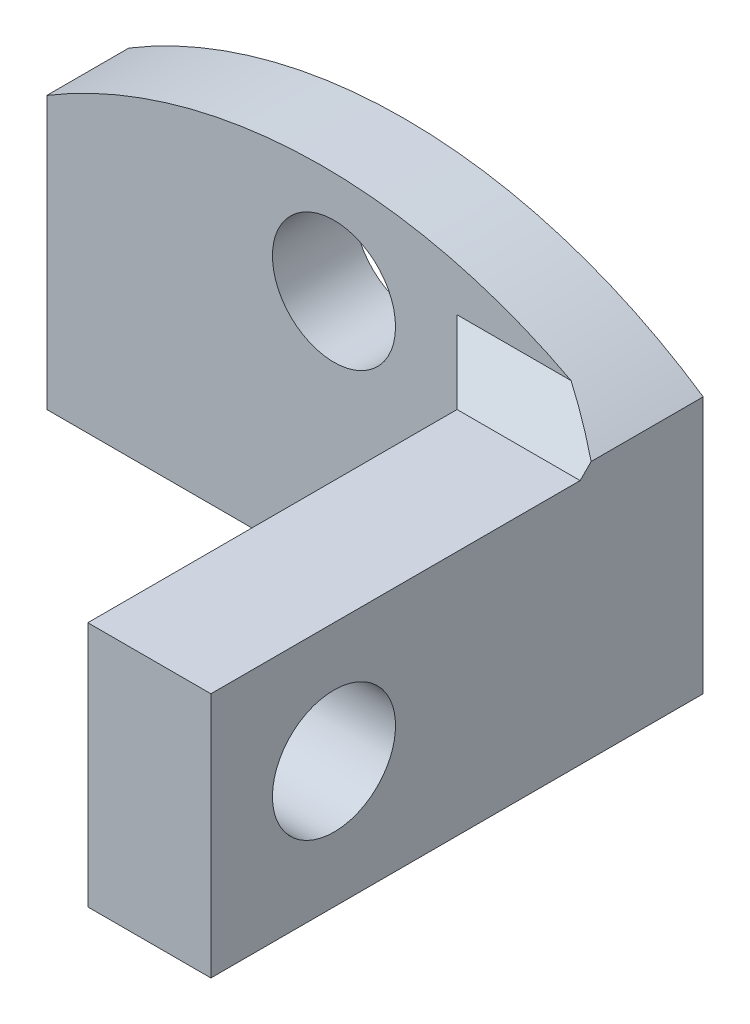
ISO-10303-21;
HEADER;
FILE_DESCRIPTION(('STEP AP214'),'2;1');
FILE_NAME('part.step','',(''),(''),'','','');
FILE_SCHEMA(('AUTOMOTIVE_DESIGN { 1 0 10303 214 1 1 1 1 }'));
ENDSEC;
DATA;
#1=APPLICATION_CONTEXT('core data for automotive mechanical design processes');
#2=APPLICATION_PROTOCOL_DEFINITION('international standard','automotive_design',2000,#1);
#3=PRODUCT_CONTEXT('',#1,'mechanical');
#4=PRODUCT('Part','Part','',(#3));
#5=PRODUCT_RELATED_PRODUCT_CATEGORY('part','',(#4));
#6=PRODUCT_DEFINITION_FORMATION('','',#4);
#7=PRODUCT_DEFINITION_CONTEXT('part definition',#1,'design');
#8=PRODUCT_DEFINITION('design','',#6,#7);
#9=PRODUCT_DEFINITION_SHAPE('','',#8);
#10=(LENGTH_UNIT() NAMED_UNIT(*) SI_UNIT(.MILLI.,.METRE.));
#11=(NAMED_UNIT(*) PLANE_ANGLE_UNIT() SI_UNIT($,.RADIAN.));
#12=(NAMED_UNIT(*) SI_UNIT($,.STERADIAN.) SOLID_ANGLE_UNIT());
#13=UNCERTAINTY_MEASURE_WITH_UNIT(LENGTH_MEASURE(1.E-05),#10,'distance_accuracy_value','');
#14=(GEOMETRIC_REPRESENTATION_CONTEXT(3) GLOBAL_UNCERTAINTY_ASSIGNED_CONTEXT((#13)) GLOBAL_UNIT_ASSIGNED_CONTEXT((#10,
#11,#12)) REPRESENTATION_CONTEXT('',''));
#15=CARTESIAN_POINT('',(0.,0.,0.));
#16=DIRECTION('',(0.,0.,1.));
#17=DIRECTION('',(1.,0.,0.));
#18=AXIS2_PLACEMENT_3D('',#15,#16,#17);
#19=CARTESIAN_POINT('',(0.,0.,2.));
#20=DIRECTION('',(0.,0.,1.));
#21=DIRECTION('',(1.,0.,0.));
#22=AXIS2_PLACEMENT_3D('',#19,#20,#21);
#23=PLANE('',#22);
#24=DIRECTION('',(0.,1.,0.));
#25=VECTOR('',#24,1.);
#26=CARTESIAN_POINT('',(3.28345119208277,0.,2.));
#27=LINE('',#26,#25);
#28=CARTESIAN_POINT('',(3.28345119208277,4.5,2.));
#29=VERTEX_POINT('',#28);
#30=CARTESIAN_POINT('',(3.28345119208277,11.5,2.));
#31=VERTEX_POINT('',#30);
#32=EDGE_CURVE('E55',#29,#31,#27,.T.);
#33=ORIENTED_EDGE('',*,*,#32,.T.);
#34=DIRECTION('',(1.,0.,0.));
#35=VECTOR('',#34,1.);
#36=CARTESIAN_POINT('',(0.,11.5,2.));
#37=LINE('',#36,#35);
#38=CARTESIAN_POINT('',(6.06217782649108,11.5,2.));
#39=VERTEX_POINT('',#38);
#40=EDGE_CURVE('E169',#31,#39,#37,.T.);
#41=ORIENTED_EDGE('',*,*,#40,.T.);
#42=CARTESIAN_POINT('',(0.,0.,2.));
#43=DIRECTION('',(0.,0.,1.));
#44=DIRECTION('',(1.,0.,0.));
#45=AXIS2_PLACEMENT_3D('',#42,#43,#44);
#46=CIRCLE('',#45,13.);
#47=CARTESIAN_POINT('',(-6.71654880791723,11.1304973882961,2.));
#48=VERTEX_POINT('',#47);
#49=EDGE_CURVE('E143',#39,#48,#46,.T.);
#50=ORIENTED_EDGE('',*,*,#49,.T.);
#51=DIRECTION('',(0.,-1.,0.));
#52=VECTOR('',#51,1.);
#53=CARTESIAN_POINT('',(-6.71654880791723,4.5,2.));
#54=LINE('',#53,#52);
#55=CARTESIAN_POINT('',(-6.71654880791723,4.5,2.));
#56=VERTEX_POINT('',#55);
#57=EDGE_CURVE('E137',#48,#56,#54,.T.);
#58=ORIENTED_EDGE('',*,*,#57,.T.);
#59=DIRECTION('',(1.,0.,0.));
#60=VECTOR('',#59,1.);
#61=CARTESIAN_POINT('',(-6.71654880791723,4.5,2.));
#62=LINE('',#61,#60);
#63=EDGE_CURVE('E140',#56,#29,#62,.T.);
#64=ORIENTED_EDGE('',*,*,#63,.T.);
#65=EDGE_LOOP('',(#33,#41,#50,#58,#64));
#66=FACE_BOUND('',#65,.T.);
#67=CARTESIAN_POINT('',(0.283451192082768,10.4961733704101,2.));
#68=DIRECTION('',(0.,0.,1.));
#69=DIRECTION('',(1.,0.,0.));
#70=AXIS2_PLACEMENT_3D('',#67,#68,#69);
#71=CIRCLE('',#70,1.5);
#72=CARTESIAN_POINT('',(1.78345119208277,10.4961733704101,2.));
#73=VERTEX_POINT('',#72);
#74=EDGE_CURVE('E128',#73,#73,#71,.T.);
#75=ORIENTED_EDGE('',*,*,#74,.F.);
#76=EDGE_LOOP('',(#75));
#77=FACE_BOUND('',#76,.T.);
#78=ADVANCED_FACE('F33',(#66,#77),#23,.T.);
#79=CARTESIAN_POINT('',(0.,0.,0.));
#80=DIRECTION('',(0.,0.,1.));
#81=DIRECTION('',(1.,0.,0.));
#82=AXIS2_PLACEMENT_3D('',#79,#80,#81);
#83=PLANE('',#82);
#84=DIRECTION('',(0.,-1.,0.));
#85=VECTOR('',#84,1.);
#86=CARTESIAN_POINT('',(-6.71654880791723,4.5,0.));
#87=LINE('',#86,#85);
#88=CARTESIAN_POINT('',(-6.71654880791723,11.1304973882961,0.));
#89=VERTEX_POINT('',#88);
#90=CARTESIAN_POINT('',(-6.71654880791723,4.5,0.));
#91=VERTEX_POINT('',#90);
#92=EDGE_CURVE('E135',#89,#91,#87,.T.);
#93=ORIENTED_EDGE('',*,*,#92,.F.);
#94=CARTESIAN_POINT('',(0.,0.,0.));
#95=DIRECTION('',(0.,0.,1.));
#96=DIRECTION('',(1.,0.,0.));
#97=AXIS2_PLACEMENT_3D('',#94,#95,#96);
#98=CIRCLE('',#97,13.);
#99=CARTESIAN_POINT('',(7.28345119208277,10.7680703346769,0.));
#100=VERTEX_POINT('',#99);
#101=EDGE_CURVE('E141',#100,#89,#98,.T.);
#102=ORIENTED_EDGE('',*,*,#101,.F.);
#103=DIRECTION('',(0.,1.,0.));
#104=VECTOR('',#103,1.);
#105=CARTESIAN_POINT('',(7.28345119208277,4.5,0.));
#106=LINE('',#105,#104);
#107=CARTESIAN_POINT('',(7.28345119208277,4.5,0.));
#108=VERTEX_POINT('',#107);
#109=EDGE_CURVE('E150',#108,#100,#106,.T.);
#110=ORIENTED_EDGE('',*,*,#109,.F.);
#111=DIRECTION('',(1.,0.,0.));
#112=VECTOR('',#111,1.);
#113=CARTESIAN_POINT('',(-6.71654880791723,4.5,0.));
#114=LINE('',#113,#112);
#115=EDGE_CURVE('E148',#91,#108,#114,.T.);
#116=ORIENTED_EDGE('',*,*,#115,.F.);
#117=EDGE_LOOP('',(#93,#102,#110,#116));
#118=FACE_BOUND('',#117,.T.);
#119=CARTESIAN_POINT('',(0.283451192082768,10.4961733704101,0.));
#120=DIRECTION('',(0.,0.,1.));
#121=DIRECTION('',(1.,0.,0.));
#122=AXIS2_PLACEMENT_3D('',#119,#120,#121);
#123=CIRCLE('',#122,1.5);
#124=CARTESIAN_POINT('',(1.78345119208277,10.4961733704101,0.));
#125=VERTEX_POINT('',#124);
#126=EDGE_CURVE('E125',#125,#125,#123,.T.);
#127=ORIENTED_EDGE('',*,*,#126,.T.);
#128=EDGE_LOOP('',(#127));
#129=FACE_BOUND('',#128,.T.);
#130=ADVANCED_FACE('F197',(#118,#129),#83,.F.);
#131=CARTESIAN_POINT('',(-6.71654880791723,4.5,2.));
#132=DIRECTION('',(1.,0.,0.));
#133=DIRECTION('',(0.,0.,-1.));
#134=AXIS2_PLACEMENT_3D('',#131,#132,#133);
#135=PLANE('',#134);
#136=ORIENTED_EDGE('',*,*,#92,.T.);
#137=DIRECTION('',(0.,0.,-1.));
#138=VECTOR('',#137,1.);
#139=CARTESIAN_POINT('',(-6.71654880791723,4.5,2.));
#140=LINE('',#139,#138);
#141=EDGE_CURVE('E158',#56,#91,#140,.T.);
#142=ORIENTED_EDGE('',*,*,#141,.F.);
#143=ORIENTED_EDGE('',*,*,#57,.F.);
#144=DIRECTION('',(0.,0.,-1.));
#145=VECTOR('',#144,1.);
#146=CARTESIAN_POINT('',(-6.71654880791723,11.1304973882961,2.));
#147=LINE('',#146,#145);
#148=EDGE_CURVE('E145',#48,#89,#147,.T.);
#149=ORIENTED_EDGE('',*,*,#148,.T.);
#150=EDGE_LOOP('',(#136,#142,#143,#149));
#151=FACE_BOUND('',#150,.T.);
#152=ADVANCED_FACE('F193',(#151),#135,.F.);
#153=CARTESIAN_POINT('',(-6.71654880791723,4.5,2.));
#154=DIRECTION('',(0.,1.,0.));
#155=DIRECTION('',(0.,0.,1.));
#156=AXIS2_PLACEMENT_3D('',#153,#154,#155);
#157=PLANE('',#156);
#158=ORIENTED_EDGE('',*,*,#115,.T.);
#159=DIRECTION('',(0.,0.,-1.));
#160=VECTOR('',#159,1.);
#161=CARTESIAN_POINT('',(7.28345119208277,4.5,2.));
#162=LINE('',#161,#160);
#163=CARTESIAN_POINT('',(7.28345119208277,4.5,12.));
#164=VERTEX_POINT('',#163);
#165=EDGE_CURVE('E156',#164,#108,#162,.T.);
#166=ORIENTED_EDGE('',*,*,#165,.F.);
#167=DIRECTION('',(1.,0.,0.));
#168=VECTOR('',#167,1.);
#169=CARTESIAN_POINT('',(7.28345119208277,4.5,12.));
#170=LINE('',#169,#168);
#171=CARTESIAN_POINT('',(4.28345119208277,4.5,12.));
#172=VERTEX_POINT('',#171);
#173=EDGE_CURVE('E119',#172,#164,#170,.T.);
#174=ORIENTED_EDGE('',*,*,#173,.F.);
#175=DIRECTION('',(0.,0.,-1.));
#176=VECTOR('',#175,1.);
#177=CARTESIAN_POINT('',(4.28345119208277,4.5,12.));
#178=LINE('',#177,#176);
#179=CARTESIAN_POINT('',(4.28345119208277,4.5,3.00000000000001));
#180=VERTEX_POINT('',#179);
#181=EDGE_CURVE('E130',#172,#180,#178,.T.);
#182=ORIENTED_EDGE('',*,*,#181,.T.);
#183=DIRECTION('',(-0.707106781186544,0.,-0.707106781186551));
#184=VECTOR('',#183,1.);
#185=CARTESIAN_POINT('',(-1.71654880791719,4.5,-3.));
#186=LINE('',#185,#184);
#187=EDGE_CURVE('E165',#180,#29,#186,.T.);
#188=ORIENTED_EDGE('',*,*,#187,.T.);
#189=ORIENTED_EDGE('',*,*,#63,.F.);
#190=ORIENTED_EDGE('',*,*,#141,.T.);
#191=EDGE_LOOP('',(#158,#166,#174,#182,#188,#189,#190));
#192=FACE_BOUND('',#191,.T.);
#193=ADVANCED_FACE('F188',(#192),#157,.F.);
#194=CARTESIAN_POINT('',(7.28345119208277,4.5,2.));
#195=DIRECTION('',(-1.,0.,0.));
#196=DIRECTION('',(0.,0.,1.));
#197=AXIS2_PLACEMENT_3D('',#194,#195,#196);
#198=PLANE('',#197);
#199=CARTESIAN_POINT('',(7.28345119208277,7.57915331329814,9.));
#200=DIRECTION('',(-1.,0.,0.));
#201=DIRECTION('',(0.,0.,1.));
#202=AXIS2_PLACEMENT_3D('',#199,#200,#201);
#203=CIRCLE('',#202,1.5);
#204=CARTESIAN_POINT('',(7.28345119208277,7.57915331329814,10.5));
#205=VERTEX_POINT('',#204);
#206=EDGE_CURVE('E121',#205,#205,#203,.F.);
#207=ORIENTED_EDGE('',*,*,#206,.F.);
#208=EDGE_LOOP('',(#207));
#209=FACE_BOUND('',#208,.T.);
#210=ORIENTED_EDGE('',*,*,#109,.T.);
#211=DIRECTION('',(0.,0.,-1.));
#212=VECTOR('',#211,1.);
#213=CARTESIAN_POINT('',(7.28345119208277,10.7680703346769,2.));
#214=LINE('',#213,#212);
#215=CARTESIAN_POINT('',(7.28345119208277,10.7680703346769,2.73192966532313));
#216=VERTEX_POINT('',#215);
#217=EDGE_CURVE('E47',#216,#100,#214,.T.);
#218=ORIENTED_EDGE('',*,*,#217,.F.);
#219=DIRECTION('',(0.,-0.707106781186544,0.707106781186551));
#220=VECTOR('',#219,1.);
#221=CARTESIAN_POINT('',(7.28345119208277,8.00000000000004,5.5));
#222=LINE('',#221,#220);
#223=CARTESIAN_POINT('',(7.28345119208277,10.5,3.00000000000001));
#224=VERTEX_POINT('',#223);
#225=EDGE_CURVE('E11',#216,#224,#222,.T.);
#226=ORIENTED_EDGE('',*,*,#225,.T.);
#227=DIRECTION('',(0.,0.,-1.));
#228=VECTOR('',#227,1.);
#229=CARTESIAN_POINT('',(7.28345119208277,10.5,12.));
#230=LINE('',#229,#228);
#231=CARTESIAN_POINT('',(7.28345119208277,10.5,12.));
#232=VERTEX_POINT('',#231);
#233=EDGE_CURVE('E106',#232,#224,#230,.T.);
#234=ORIENTED_EDGE('',*,*,#233,.F.);
#235=DIRECTION('',(0.,1.,0.));
#236=VECTOR('',#235,1.);
#237=CARTESIAN_POINT('',(7.28345119208277,4.5,12.));
#238=LINE('',#237,#236);
#239=EDGE_CURVE('E113',#164,#232,#238,.T.);
#240=ORIENTED_EDGE('',*,*,#239,.F.);
#241=ORIENTED_EDGE('',*,*,#165,.T.);
#242=EDGE_LOOP('',(#210,#218,#226,#234,#240,#241));
#243=FACE_BOUND('',#242,.T.);
#244=ADVANCED_FACE('F123',(#209,#243),#198,.F.);
#245=CARTESIAN_POINT('',(0.,0.,2.));
#246=DIRECTION('',(0.,0.,-1.));
#247=DIRECTION('',(-1.,0.,0.));
#248=AXIS2_PLACEMENT_3D('',#245,#246,#247);
#249=CYLINDRICAL_SURFACE('',#248,13.);
#250=ORIENTED_EDGE('',*,*,#101,.T.);
#251=ORIENTED_EDGE('',*,*,#148,.F.);
#252=ORIENTED_EDGE('',*,*,#49,.F.);
#253=CARTESIAN_POINT('',(0.,0.,13.5000000000001));
#254=DIRECTION('',(0.,-0.707106781186552,-0.707106781186544));
#255=DIRECTION('',(0.,0.707106781186544,-0.707106781186551));
#256=AXIS2_PLACEMENT_3D('',#253,#254,#255);
#257=ELLIPSE('',#256,18.3847763108503,13.);
#258=EDGE_CURVE('E41',#39,#216,#257,.T.);
#259=ORIENTED_EDGE('',*,*,#258,.T.);
#260=ORIENTED_EDGE('',*,*,#217,.T.);
#261=EDGE_LOOP('',(#250,#251,#252,#259,#260));
#262=FACE_BOUND('',#261,.T.);
#263=ADVANCED_FACE('F175',(#262),#249,.T.);
#264=CARTESIAN_POINT('',(0.283451192082768,10.4961733704101,2.));
#265=DIRECTION('',(0.,0.,-1.));
#266=DIRECTION('',(-1.,0.,0.));
#267=AXIS2_PLACEMENT_3D('',#264,#265,#266);
#268=CYLINDRICAL_SURFACE('',#267,1.5);
#269=ORIENTED_EDGE('',*,*,#74,.T.);
#270=EDGE_LOOP('',(#269));
#271=FACE_BOUND('',#270,.T.);
#272=ORIENTED_EDGE('',*,*,#126,.F.);
#273=EDGE_LOOP('',(#272));
#274=FACE_BOUND('',#273,.T.);
#275=ADVANCED_FACE('F203',(#271,#274),#268,.F.);
#276=CARTESIAN_POINT('',(7.28345119208277,10.5,12.));
#277=DIRECTION('',(0.,-1.,0.));
#278=DIRECTION('',(1.,0.,0.));
#279=AXIS2_PLACEMENT_3D('',#276,#277,#278);
#280=PLANE('',#279);
#281=ORIENTED_EDGE('',*,*,#233,.T.);
#282=DIRECTION('',(-1.,0.,0.));
#283=VECTOR('',#282,1.);
#284=CARTESIAN_POINT('',(7.28345119208277,10.5,3.00000000000001));
#285=LINE('',#284,#283);
#286=CARTESIAN_POINT('',(4.28345119208277,10.5,3.00000000000001));
#287=VERTEX_POINT('',#286);
#288=EDGE_CURVE('E167',#224,#287,#285,.T.);
#289=ORIENTED_EDGE('',*,*,#288,.T.);
#290=DIRECTION('',(0.,0.,-1.));
#291=VECTOR('',#290,1.);
#292=CARTESIAN_POINT('',(4.28345119208277,10.5,12.));
#293=LINE('',#292,#291);
#294=CARTESIAN_POINT('',(4.28345119208277,10.5,12.));
#295=VERTEX_POINT('',#294);
#296=EDGE_CURVE('E109',#295,#287,#293,.T.);
#297=ORIENTED_EDGE('',*,*,#296,.F.);
#298=DIRECTION('',(-1.,0.,0.));
#299=VECTOR('',#298,1.);
#300=CARTESIAN_POINT('',(7.28345119208277,10.5,12.));
#301=LINE('',#300,#299);
#302=EDGE_CURVE('E101',#232,#295,#301,.T.);
#303=ORIENTED_EDGE('',*,*,#302,.F.);
#304=EDGE_LOOP('',(#281,#289,#297,#303));
#305=FACE_BOUND('',#304,.T.);
#306=ADVANCED_FACE('F103',(#305),#280,.F.);
#307=CARTESIAN_POINT('',(4.28345119208277,4.5,12.));
#308=DIRECTION('',(1.,0.,0.));
#309=DIRECTION('',(0.,0.,-1.));
#310=AXIS2_PLACEMENT_3D('',#307,#308,#309);
#311=PLANE('',#310);
#312=CARTESIAN_POINT('',(4.28345119208277,7.57915331329814,9.));
#313=DIRECTION('',(-1.,0.,0.));
#314=DIRECTION('',(0.,0.,1.));
#315=AXIS2_PLACEMENT_3D('',#312,#313,#314);
#316=CIRCLE('',#315,1.5);
#317=CARTESIAN_POINT('',(4.28345119208277,7.57915331329814,10.5));
#318=VERTEX_POINT('',#317);
#319=EDGE_CURVE('E247',#318,#318,#316,.T.);
#320=ORIENTED_EDGE('',*,*,#319,.F.);
#321=EDGE_LOOP('',(#320));
#322=FACE_BOUND('',#321,.T.);
#323=ORIENTED_EDGE('',*,*,#296,.T.);
#324=DIRECTION('',(0.,-1.,0.));
#325=VECTOR('',#324,1.);
#326=CARTESIAN_POINT('',(4.28345119208277,4.5,3.00000000000001));
#327=LINE('',#326,#325);
#328=EDGE_CURVE('E161',#287,#180,#327,.T.);
#329=ORIENTED_EDGE('',*,*,#328,.T.);
#330=ORIENTED_EDGE('',*,*,#181,.F.);
#331=DIRECTION('',(0.,-1.,0.));
#332=VECTOR('',#331,1.);
#333=CARTESIAN_POINT('',(4.28345119208277,4.5,12.));
#334=LINE('',#333,#332);
#335=EDGE_CURVE('E112',#295,#172,#334,.T.);
#336=ORIENTED_EDGE('',*,*,#335,.F.);
#337=EDGE_LOOP('',(#323,#329,#330,#336));
#338=FACE_BOUND('',#337,.T.);
#339=ADVANCED_FACE('F182',(#322,#338),#311,.F.);
#340=CARTESIAN_POINT('',(0.,0.,12.));
#341=DIRECTION('',(0.,0.,1.));
#342=DIRECTION('',(1.,0.,0.));
#343=AXIS2_PLACEMENT_3D('',#340,#341,#342);
#344=PLANE('',#343);
#345=ORIENTED_EDGE('',*,*,#239,.T.);
#346=ORIENTED_EDGE('',*,*,#302,.T.);
#347=ORIENTED_EDGE('',*,*,#335,.T.);
#348=ORIENTED_EDGE('',*,*,#173,.T.);
#349=EDGE_LOOP('',(#345,#346,#347,#348));
#350=FACE_BOUND('',#349,.T.);
#351=ADVANCED_FACE('F117',(#350),#344,.T.);
#352=CARTESIAN_POINT('',(11.5260918792021,7.57915331329814,9.));
#353=DIRECTION('',(-1.,0.,0.));
#354=DIRECTION('',(0.,0.,1.));
#355=AXIS2_PLACEMENT_3D('',#352,#353,#354);
#356=CYLINDRICAL_SURFACE('',#355,1.5);
#357=ORIENTED_EDGE('',*,*,#206,.T.);
#358=EDGE_LOOP('',(#357));
#359=FACE_BOUND('',#358,.T.);
#360=ORIENTED_EDGE('',*,*,#319,.T.);
#361=EDGE_LOOP('',(#360));
#362=FACE_BOUND('',#361,.T.);
#363=ADVANCED_FACE('F227',(#359,#362),#356,.F.);
#364=CARTESIAN_POINT('',(4.28345119208277,4.5,3.00000000000001));
#365=DIRECTION('',(0.707106781186551,0.,-0.707106781186544));
#366=DIRECTION('',(0.,-1.,0.));
#367=AXIS2_PLACEMENT_3D('',#364,#365,#366);
#368=PLANE('',#367);
#369=ORIENTED_EDGE('',*,*,#328,.F.);
#370=DIRECTION('',(-0.577350269189624,0.577350269189623,-0.577350269189629));
#371=VECTOR('',#370,1.);
#372=CARTESIAN_POINT('',(6.28345119208275,8.50000000000001,5.00000000000001));
#373=LINE('',#372,#371);
#374=EDGE_CURVE('E171',#287,#31,#373,.T.);
#375=ORIENTED_EDGE('',*,*,#374,.T.);
#376=ORIENTED_EDGE('',*,*,#32,.F.);
#377=ORIENTED_EDGE('',*,*,#187,.F.);
#378=EDGE_LOOP('',(#369,#375,#376,#377));
#379=FACE_BOUND('',#378,.T.);
#380=ADVANCED_FACE('F186',(#379),#368,.F.);
#381=CARTESIAN_POINT('',(7.28345119208277,10.5,3.00000000000001));
#382=DIRECTION('',(0.,-0.707106781186552,-0.707106781186544));
#383=DIRECTION('',(-1.,0.,0.));
#384=AXIS2_PLACEMENT_3D('',#381,#382,#383);
#385=PLANE('',#384);
#386=ORIENTED_EDGE('',*,*,#258,.F.);
#387=ORIENTED_EDGE('',*,*,#40,.F.);
#388=ORIENTED_EDGE('',*,*,#374,.F.);
#389=ORIENTED_EDGE('',*,*,#288,.F.);
#390=ORIENTED_EDGE('',*,*,#225,.F.);
#391=EDGE_LOOP('',(#386,#387,#388,#389,#390));
#392=FACE_BOUND('',#391,.T.);
#393=ADVANCED_FACE('F35',(#392),#385,.F.);
#394=CLOSED_SHELL('',(#78,#130,#152,#193,#244,#263,#275,#306,#339,#351,#363,#380,#393));
#395=MANIFOLD_SOLID_BREP('B2',#394);
#396=ADVANCED_BREP_SHAPE_REPRESENTATION('',(#18,#395),#14);
#397=SHAPE_DEFINITION_REPRESENTATION(#9,#396);
ENDSEC;
END-ISO-10303-21;
